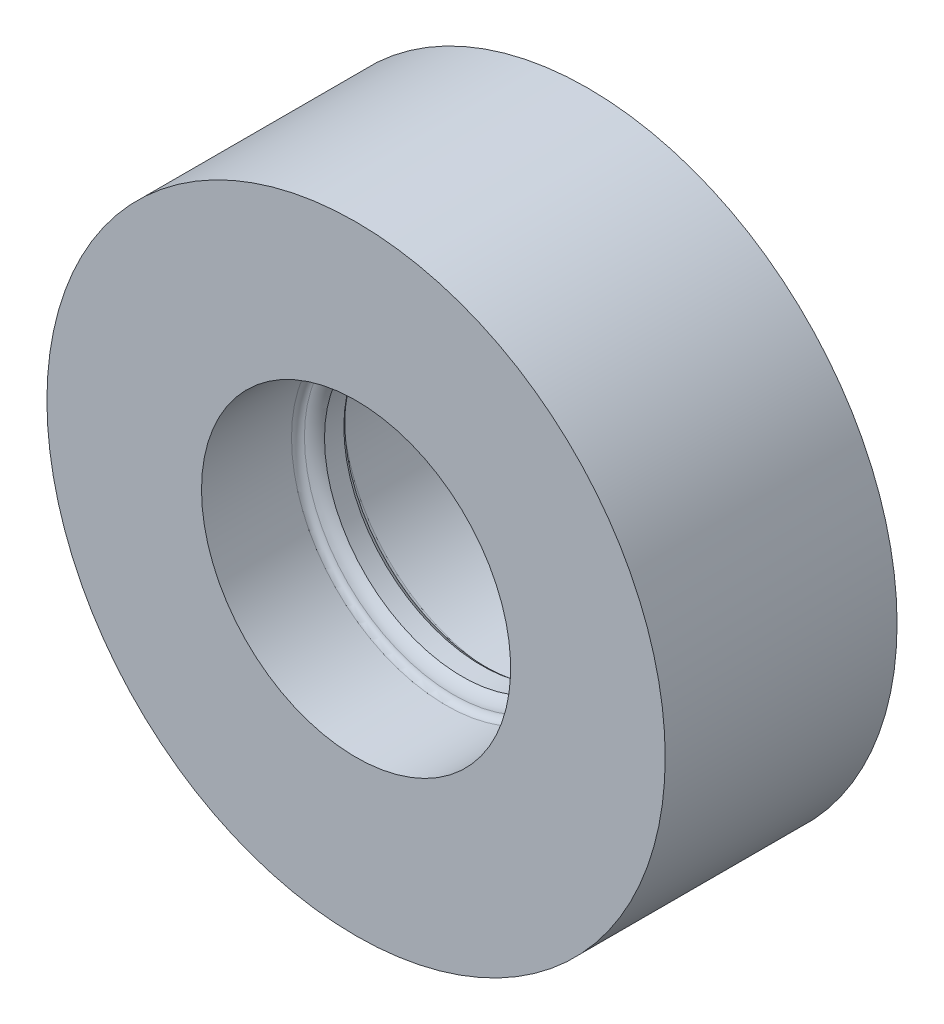
ISO-10303-21;
HEADER;
FILE_DESCRIPTION(('STEP AP214'),'2;1');
FILE_NAME('part.step','',(''),(''),'','','');
FILE_SCHEMA(('AUTOMOTIVE_DESIGN { 1 0 10303 214 1 1 1 1 }'));
ENDSEC;
DATA;
#1=APPLICATION_CONTEXT('core data for automotive mechanical design processes');
#2=APPLICATION_PROTOCOL_DEFINITION('international standard','automotive_design',2000,#1);
#3=PRODUCT_CONTEXT('',#1,'mechanical');
#4=PRODUCT('Part','Part','',(#3));
#5=PRODUCT_RELATED_PRODUCT_CATEGORY('part','',(#4));
#6=PRODUCT_DEFINITION_FORMATION('','',#4);
#7=PRODUCT_DEFINITION_CONTEXT('part definition',#1,'design');
#8=PRODUCT_DEFINITION('design','',#6,#7);
#9=PRODUCT_DEFINITION_SHAPE('','',#8);
#10=(LENGTH_UNIT() NAMED_UNIT(*) SI_UNIT(.MILLI.,.METRE.));
#11=(NAMED_UNIT(*) PLANE_ANGLE_UNIT() SI_UNIT($,.RADIAN.));
#12=(NAMED_UNIT(*) SI_UNIT($,.STERADIAN.) SOLID_ANGLE_UNIT());
#13=UNCERTAINTY_MEASURE_WITH_UNIT(LENGTH_MEASURE(1.E-05),#10,'distance_accuracy_value','');
#14=(GEOMETRIC_REPRESENTATION_CONTEXT(3) GLOBAL_UNCERTAINTY_ASSIGNED_CONTEXT((#13)) GLOBAL_UNIT_ASSIGNED_CONTEXT((#10,
#11,#12)) REPRESENTATION_CONTEXT('',''));
#15=CARTESIAN_POINT('',(0.,0.,0.));
#16=DIRECTION('',(0.,0.,1.));
#17=DIRECTION('',(1.,0.,0.));
#18=AXIS2_PLACEMENT_3D('',#15,#16,#17);
#19=CARTESIAN_POINT('',(0.,0.,0.));
#20=DIRECTION('',(0.,0.,-1.));
#21=DIRECTION('',(-1.,0.,0.));
#22=AXIS2_PLACEMENT_3D('',#19,#20,#21);
#23=CYLINDRICAL_SURFACE('',#22,3.56698729810778);
#24=CARTESIAN_POINT('',(0.,0.,2.75));
#25=DIRECTION('',(0.,0.,-1.));
#26=DIRECTION('',(-1.,0.,0.));
#27=AXIS2_PLACEMENT_3D('',#24,#25,#26);
#28=CIRCLE('',#27,3.56698729810778);
#29=CARTESIAN_POINT('',(-3.56698729810778,0.,2.75));
#30=VERTEX_POINT('',#29);
#31=EDGE_CURVE('E72',#30,#30,#28,.F.);
#32=ORIENTED_EDGE('',*,*,#31,.F.);
#33=EDGE_LOOP('',(#32));
#34=FACE_BOUND('',#33,.T.);
#35=CARTESIAN_POINT('',(0.,0.,3.25));
#36=DIRECTION('',(0.,0.,-1.));
#37=DIRECTION('',(-1.,0.,0.));
#38=AXIS2_PLACEMENT_3D('',#35,#36,#37);
#39=CIRCLE('',#38,3.56698729810778);
#40=CARTESIAN_POINT('',(-3.56698729810778,0.,3.25));
#41=VERTEX_POINT('',#40);
#42=EDGE_CURVE('E30',#41,#41,#39,.T.);
#43=ORIENTED_EDGE('',*,*,#42,.F.);
#44=EDGE_LOOP('',(#43));
#45=FACE_BOUND('',#44,.T.);
#46=ADVANCED_FACE('F15',(#34,#45),#23,.F.);
#47=CARTESIAN_POINT('',(0.,0.,3.));
#48=DIRECTION('',(0.,0.,-1.));
#49=DIRECTION('',(-1.,0.,0.));
#50=AXIS2_PLACEMENT_3D('',#47,#48,#49);
#51=TOROIDAL_SURFACE('',#50,4.,0.5);
#52=ORIENTED_EDGE('',*,*,#42,.T.);
#53=EDGE_LOOP('',(#52));
#54=FACE_BOUND('',#53,.T.);
#55=CARTESIAN_POINT('',(0.,0.,3.47915742374996));
#56=DIRECTION('',(0.,0.,-1.));
#57=DIRECTION('',(-1.,0.,0.));
#58=AXIS2_PLACEMENT_3D('',#55,#56,#57);
#59=CIRCLE('',#58,3.85714285714285);
#60=CARTESIAN_POINT('',(-3.85714285714285,0.,3.47915742374996));
#61=VERTEX_POINT('',#60);
#62=EDGE_CURVE('E71',#61,#61,#59,.F.);
#63=ORIENTED_EDGE('',*,*,#62,.T.);
#64=EDGE_LOOP('',(#63));
#65=FACE_BOUND('',#64,.T.);
#66=ADVANCED_FACE('F64',(#54,#65),#51,.T.);
#67=CARTESIAN_POINT('',(0.,0.,3.));
#68=DIRECTION('',(0.,0.,-1.));
#69=DIRECTION('',(-1.,0.,0.));
#70=AXIS2_PLACEMENT_3D('',#67,#68,#69);
#71=TOROIDAL_SURFACE('',#70,4.,0.5);
#72=CARTESIAN_POINT('',(0.,0.,2.52084257625005));
#73=DIRECTION('',(0.,0.,-1.));
#74=DIRECTION('',(-1.,0.,0.));
#75=AXIS2_PLACEMENT_3D('',#72,#73,#74);
#76=CIRCLE('',#75,3.85714285714286);
#77=CARTESIAN_POINT('',(-3.85714285714286,0.,2.52084257625005));
#78=VERTEX_POINT('',#77);
#79=EDGE_CURVE('E45',#78,#78,#76,.T.);
#80=ORIENTED_EDGE('',*,*,#79,.T.);
#81=EDGE_LOOP('',(#80));
#82=FACE_BOUND('',#81,.T.);
#83=ORIENTED_EDGE('',*,*,#31,.T.);
#84=EDGE_LOOP('',(#83));
#85=FACE_BOUND('',#84,.T.);
#86=ADVANCED_FACE('F60',(#82,#85),#71,.T.);
#87=CARTESIAN_POINT('',(0.,0.,3.67082039324994));
#88=DIRECTION('',(0.,0.,-1.));
#89=DIRECTION('',(-1.,0.,0.));
#90=AXIS2_PLACEMENT_3D('',#87,#88,#89);
#91=TOROIDAL_SURFACE('',#90,3.8,0.2);
#92=ORIENTED_EDGE('',*,*,#62,.F.);
#93=EDGE_LOOP('',(#92));
#94=FACE_BOUND('',#93,.T.);
#95=CARTESIAN_POINT('',(0.,0.,3.67082039324994));
#96=DIRECTION('',(0.,0.,-1.));
#97=DIRECTION('',(-1.,0.,0.));
#98=AXIS2_PLACEMENT_3D('',#95,#96,#97);
#99=CIRCLE('',#98,4.);
#100=CARTESIAN_POINT('',(-4.,0.,3.67082039324994));
#101=VERTEX_POINT('',#100);
#102=EDGE_CURVE('E40',#101,#101,#99,.F.);
#103=ORIENTED_EDGE('',*,*,#102,.T.);
#104=EDGE_LOOP('',(#103));
#105=FACE_BOUND('',#104,.T.);
#106=ADVANCED_FACE('F55',(#94,#105),#91,.F.);
#107=CARTESIAN_POINT('',(0.,0.,2.32917960675006));
#108=DIRECTION('',(0.,0.,-1.));
#109=DIRECTION('',(-1.,0.,0.));
#110=AXIS2_PLACEMENT_3D('',#107,#108,#109);
#111=TOROIDAL_SURFACE('',#110,3.8,0.2);
#112=CARTESIAN_POINT('',(0.,0.,2.32917960675006));
#113=DIRECTION('',(0.,0.,-1.));
#114=DIRECTION('',(-1.,0.,0.));
#115=AXIS2_PLACEMENT_3D('',#112,#113,#114);
#116=CIRCLE('',#115,4.);
#117=CARTESIAN_POINT('',(-4.,0.,2.32917960675006));
#118=VERTEX_POINT('',#117);
#119=EDGE_CURVE('E36',#118,#118,#116,.T.);
#120=ORIENTED_EDGE('',*,*,#119,.T.);
#121=EDGE_LOOP('',(#120));
#122=FACE_BOUND('',#121,.T.);
#123=ORIENTED_EDGE('',*,*,#79,.F.);
#124=EDGE_LOOP('',(#123));
#125=FACE_BOUND('',#124,.T.);
#126=ADVANCED_FACE('F59',(#122,#125),#111,.F.);
#127=CARTESIAN_POINT('',(0.,0.,0.));
#128=DIRECTION('',(0.,0.,-1.));
#129=DIRECTION('',(-1.,0.,0.));
#130=AXIS2_PLACEMENT_3D('',#127,#128,#129);
#131=CYLINDRICAL_SURFACE('',#130,4.);
#132=ORIENTED_EDGE('',*,*,#102,.F.);
#133=EDGE_LOOP('',(#132));
#134=FACE_BOUND('',#133,.T.);
#135=CARTESIAN_POINT('',(0.,0.,6.));
#136=DIRECTION('',(0.,0.,-1.));
#137=DIRECTION('',(-1.,0.,0.));
#138=AXIS2_PLACEMENT_3D('',#135,#136,#137);
#139=CIRCLE('',#138,4.);
#140=CARTESIAN_POINT('',(-4.,0.,6.));
#141=VERTEX_POINT('',#140);
#142=EDGE_CURVE('E18',#141,#141,#139,.T.);
#143=ORIENTED_EDGE('',*,*,#142,.F.);
#144=EDGE_LOOP('',(#143));
#145=FACE_BOUND('',#144,.T.);
#146=ADVANCED_FACE('F104',(#134,#145),#131,.F.);
#147=CARTESIAN_POINT('',(0.,0.,0.));
#148=DIRECTION('',(0.,0.,-1.));
#149=DIRECTION('',(-1.,0.,0.));
#150=AXIS2_PLACEMENT_3D('',#147,#148,#149);
#151=CYLINDRICAL_SURFACE('',#150,4.);
#152=CARTESIAN_POINT('',(0.,0.,0.));
#153=DIRECTION('',(0.,0.,-1.));
#154=DIRECTION('',(-1.,0.,0.));
#155=AXIS2_PLACEMENT_3D('',#152,#153,#154);
#156=CIRCLE('',#155,4.);
#157=CARTESIAN_POINT('',(-4.,0.,0.));
#158=VERTEX_POINT('',#157);
#159=EDGE_CURVE('E27',#158,#158,#156,.F.);
#160=ORIENTED_EDGE('',*,*,#159,.F.);
#161=EDGE_LOOP('',(#160));
#162=FACE_BOUND('',#161,.T.);
#163=ORIENTED_EDGE('',*,*,#119,.F.);
#164=EDGE_LOOP('',(#163));
#165=FACE_BOUND('',#164,.T.);
#166=ADVANCED_FACE('F101',(#162,#165),#151,.F.);
#167=CARTESIAN_POINT('',(-8.,0.,6.));
#168=DIRECTION('',(0.,0.,1.));
#169=DIRECTION('',(1.,0.,0.));
#170=AXIS2_PLACEMENT_3D('',#167,#168,#169);
#171=PLANE('',#170);
#172=CARTESIAN_POINT('',(0.,0.,6.));
#173=DIRECTION('',(0.,0.,-1.));
#174=DIRECTION('',(-1.,0.,0.));
#175=AXIS2_PLACEMENT_3D('',#172,#173,#174);
#176=CIRCLE('',#175,8.);
#177=CARTESIAN_POINT('',(-8.,0.,6.));
#178=VERTEX_POINT('',#177);
#179=EDGE_CURVE('E22',#178,#178,#176,.T.);
#180=ORIENTED_EDGE('',*,*,#179,.F.);
#181=EDGE_LOOP('',(#180));
#182=FACE_BOUND('',#181,.T.);
#183=ORIENTED_EDGE('',*,*,#142,.T.);
#184=EDGE_LOOP('',(#183));
#185=FACE_BOUND('',#184,.T.);
#186=ADVANCED_FACE('F95',(#182,#185),#171,.T.);
#187=CARTESIAN_POINT('',(-8.,0.,0.));
#188=DIRECTION('',(0.,0.,-1.));
#189=DIRECTION('',(-1.,0.,0.));
#190=AXIS2_PLACEMENT_3D('',#187,#188,#189);
#191=PLANE('',#190);
#192=ORIENTED_EDGE('',*,*,#159,.T.);
#193=EDGE_LOOP('',(#192));
#194=FACE_BOUND('',#193,.T.);
#195=CARTESIAN_POINT('',(0.,0.,0.));
#196=DIRECTION('',(0.,0.,-1.));
#197=DIRECTION('',(-1.,0.,0.));
#198=AXIS2_PLACEMENT_3D('',#195,#196,#197);
#199=CIRCLE('',#198,8.);
#200=CARTESIAN_POINT('',(-8.,0.,0.));
#201=VERTEX_POINT('',#200);
#202=EDGE_CURVE('E10',#201,#201,#199,.F.);
#203=ORIENTED_EDGE('',*,*,#202,.F.);
#204=EDGE_LOOP('',(#203));
#205=FACE_BOUND('',#204,.T.);
#206=ADVANCED_FACE('F89',(#194,#205),#191,.T.);
#207=CARTESIAN_POINT('',(0.,0.,0.));
#208=DIRECTION('',(0.,0.,-1.));
#209=DIRECTION('',(-1.,0.,0.));
#210=AXIS2_PLACEMENT_3D('',#207,#208,#209);
#211=CYLINDRICAL_SURFACE('',#210,8.);
#212=ORIENTED_EDGE('',*,*,#202,.T.);
#213=EDGE_LOOP('',(#212));
#214=FACE_BOUND('',#213,.T.);
#215=ORIENTED_EDGE('',*,*,#179,.T.);
#216=EDGE_LOOP('',(#215));
#217=FACE_BOUND('',#216,.T.);
#218=ADVANCED_FACE('F87',(#214,#217),#211,.T.);
#219=CLOSED_SHELL('',(#46,#66,#86,#106,#126,#146,#166,#186,#206,#218));
#220=MANIFOLD_SOLID_BREP('B1',#219);
#221=ADVANCED_BREP_SHAPE_REPRESENTATION('',(#18,#220),#14);
#222=SHAPE_DEFINITION_REPRESENTATION(#9,#221);
ENDSEC;
END-ISO-10303-21;
